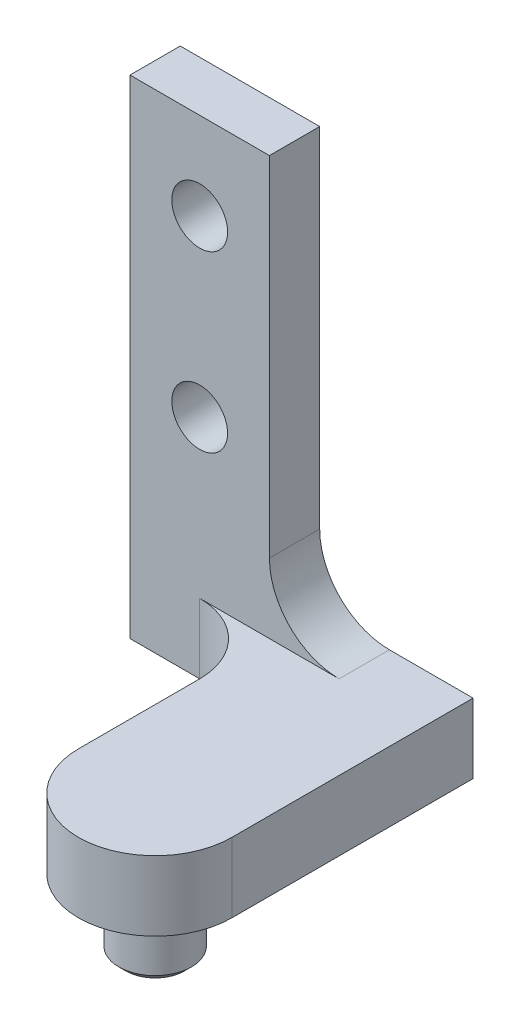
ISO-10303-21;
HEADER;
FILE_DESCRIPTION(('STEP AP214'),'2;1');
FILE_NAME('part.step','',(''),(''),'','','');
FILE_SCHEMA(('AUTOMOTIVE_DESIGN { 1 0 10303 214 1 1 1 1 }'));
ENDSEC;
DATA;
#1=APPLICATION_CONTEXT('core data for automotive mechanical design processes');
#2=APPLICATION_PROTOCOL_DEFINITION('international standard','automotive_design',2000,#1);
#3=PRODUCT_CONTEXT('',#1,'mechanical');
#4=PRODUCT('Part','Part','',(#3));
#5=PRODUCT_RELATED_PRODUCT_CATEGORY('part','',(#4));
#6=PRODUCT_DEFINITION_FORMATION('','',#4);
#7=PRODUCT_DEFINITION_CONTEXT('part definition',#1,'design');
#8=PRODUCT_DEFINITION('design','',#6,#7);
#9=PRODUCT_DEFINITION_SHAPE('','',#8);
#10=(LENGTH_UNIT() NAMED_UNIT(*) SI_UNIT(.MILLI.,.METRE.));
#11=(NAMED_UNIT(*) PLANE_ANGLE_UNIT() SI_UNIT($,.RADIAN.));
#12=(NAMED_UNIT(*) SI_UNIT($,.STERADIAN.) SOLID_ANGLE_UNIT());
#13=UNCERTAINTY_MEASURE_WITH_UNIT(LENGTH_MEASURE(1.E-05),#10,'distance_accuracy_value','');
#14=(GEOMETRIC_REPRESENTATION_CONTEXT(3) GLOBAL_UNCERTAINTY_ASSIGNED_CONTEXT((#13)) GLOBAL_UNIT_ASSIGNED_CONTEXT((#10,
#11,#12)) REPRESENTATION_CONTEXT('',''));
#15=CARTESIAN_POINT('',(0.,0.,0.));
#16=DIRECTION('',(0.,0.,1.));
#17=DIRECTION('',(1.,0.,0.));
#18=AXIS2_PLACEMENT_3D('',#15,#16,#17);
#19=CARTESIAN_POINT('',(-16.0962648941527,5.,4.61112093037529));
#20=DIRECTION('',(0.,-1.,0.));
#21=DIRECTION('',(0.,0.,-1.));
#22=AXIS2_PLACEMENT_3D('',#19,#20,#21);
#23=CYLINDRICAL_SURFACE('',#22,5.5);
#24=CARTESIAN_POINT('',(-16.0962648941527,0.,4.61112093037529));
#25=DIRECTION('',(0.,1.,0.));
#26=DIRECTION('',(0.,0.,1.));
#27=AXIS2_PLACEMENT_3D('',#24,#25,#26);
#28=CIRCLE('',#27,5.5);
#29=CARTESIAN_POINT('',(-21.5962648941527,0.,4.61112093037529));
#30=VERTEX_POINT('',#29);
#31=CARTESIAN_POINT('',(-10.5962648941527,0.,4.61112093037529));
#32=VERTEX_POINT('',#31);
#33=EDGE_CURVE('E159',#30,#32,#28,.T.);
#34=ORIENTED_EDGE('',*,*,#33,.T.);
#35=DIRECTION('',(0.,-1.,0.));
#36=VECTOR('',#35,1.);
#37=CARTESIAN_POINT('',(-10.5962648941527,5.,4.61112093037529));
#38=LINE('',#37,#36);
#39=CARTESIAN_POINT('',(-10.5962648941527,5.,4.61112093037529));
#40=VERTEX_POINT('',#39);
#41=EDGE_CURVE('E186',#40,#32,#38,.T.);
#42=ORIENTED_EDGE('',*,*,#41,.F.);
#43=CARTESIAN_POINT('',(-16.0962648941527,5.,4.61112093037529));
#44=DIRECTION('',(0.,1.,0.));
#45=DIRECTION('',(0.,0.,1.));
#46=AXIS2_PLACEMENT_3D('',#43,#44,#45);
#47=CIRCLE('',#46,5.5);
#48=CARTESIAN_POINT('',(-21.5962648941527,5.,4.61112093037529));
#49=VERTEX_POINT('',#48);
#50=EDGE_CURVE('E163',#49,#40,#47,.T.);
#51=ORIENTED_EDGE('',*,*,#50,.F.);
#52=DIRECTION('',(0.,-1.,0.));
#53=VECTOR('',#52,1.);
#54=CARTESIAN_POINT('',(-21.5962648941527,5.,4.61112093037529));
#55=LINE('',#54,#53);
#56=EDGE_CURVE('E175',#49,#30,#55,.T.);
#57=ORIENTED_EDGE('',*,*,#56,.T.);
#58=EDGE_LOOP('',(#34,#42,#51,#57));
#59=FACE_BOUND('',#58,.T.);
#60=ADVANCED_FACE('F45',(#59),#23,.T.);
#61=CARTESIAN_POINT('',(-10.5962648941527,5.,0.));
#62=DIRECTION('',(-1.,0.,0.));
#63=DIRECTION('',(0.,0.,1.));
#64=AXIS2_PLACEMENT_3D('',#61,#62,#63);
#65=PLANE('',#64);
#66=DIRECTION('',(0.,0.,-1.));
#67=VECTOR('',#66,1.);
#68=CARTESIAN_POINT('',(-10.5962648941527,0.,0.));
#69=LINE('',#68,#67);
#70=CARTESIAN_POINT('',(-10.5962648941527,0.,-12.6888790696247));
#71=VERTEX_POINT('',#70);
#72=EDGE_CURVE('E178',#32,#71,#69,.T.);
#73=ORIENTED_EDGE('',*,*,#72,.T.);
#74=DIRECTION('',(0.,-1.,0.));
#75=VECTOR('',#74,1.);
#76=CARTESIAN_POINT('',(-10.5962648941527,5.,-12.6888790696247));
#77=LINE('',#76,#75);
#78=CARTESIAN_POINT('',(-10.5962648941527,5.,-12.6888790696247));
#79=VERTEX_POINT('',#78);
#80=EDGE_CURVE('E184',#79,#71,#77,.T.);
#81=ORIENTED_EDGE('',*,*,#80,.F.);
#82=DIRECTION('',(0.,0.,-1.));
#83=VECTOR('',#82,1.);
#84=CARTESIAN_POINT('',(-10.5962648941527,5.,0.));
#85=LINE('',#84,#83);
#86=EDGE_CURVE('E166',#40,#79,#85,.T.);
#87=ORIENTED_EDGE('',*,*,#86,.F.);
#88=ORIENTED_EDGE('',*,*,#41,.T.);
#89=EDGE_LOOP('',(#73,#81,#87,#88));
#90=FACE_BOUND('',#89,.T.);
#91=ADVANCED_FACE('F242',(#90),#65,.F.);
#92=CARTESIAN_POINT('',(0.,5.,-12.6888790696247));
#93=DIRECTION('',(0.,0.,1.));
#94=DIRECTION('',(1.,0.,0.));
#95=AXIS2_PLACEMENT_3D('',#92,#93,#94);
#96=PLANE('',#95);
#97=CARTESIAN_POINT('',(-26.5962648941527,28.75,-12.6888790696247));
#98=DIRECTION('',(0.,0.,1.));
#99=DIRECTION('',(1.,0.,0.));
#100=AXIS2_PLACEMENT_3D('',#97,#98,#99);
#101=CIRCLE('',#100,2.);
#102=CARTESIAN_POINT('',(-24.5962648941527,28.75,-12.6888790696247));
#103=VERTEX_POINT('',#102);
#104=EDGE_CURVE('E152',#103,#103,#101,.T.);
#105=ORIENTED_EDGE('',*,*,#104,.T.);
#106=EDGE_LOOP('',(#105));
#107=FACE_BOUND('',#106,.T.);
#108=CARTESIAN_POINT('',(-26.5962648941527,16.25,-12.6888790696247));
#109=DIRECTION('',(0.,0.,1.));
#110=DIRECTION('',(1.,0.,0.));
#111=AXIS2_PLACEMENT_3D('',#108,#109,#110);
#112=CIRCLE('',#111,2.);
#113=CARTESIAN_POINT('',(-24.5962648941527,16.25,-12.6888790696247));
#114=VERTEX_POINT('',#113);
#115=EDGE_CURVE('E416',#114,#114,#112,.T.);
#116=ORIENTED_EDGE('',*,*,#115,.T.);
#117=EDGE_LOOP('',(#116));
#118=FACE_BOUND('',#117,.T.);
#119=DIRECTION('',(-1.,0.,0.));
#120=VECTOR('',#119,1.);
#121=CARTESIAN_POINT('',(0.,0.,-12.6888790696247));
#122=LINE('',#121,#120);
#123=CARTESIAN_POINT('',(-31.5962648941527,0.,-12.6888790696247));
#124=VERTEX_POINT('',#123);
#125=EDGE_CURVE('E136',#71,#124,#122,.T.);
#126=ORIENTED_EDGE('',*,*,#125,.T.);
#127=DIRECTION('',(0.,-1.,0.));
#128=VECTOR('',#127,1.);
#129=CARTESIAN_POINT('',(-31.5962648941527,35.,-12.6888790696247));
#130=LINE('',#129,#128);
#131=CARTESIAN_POINT('',(-31.5962648941527,35.,-12.6888790696247));
#132=VERTEX_POINT('',#131);
#133=EDGE_CURVE('E132',#132,#124,#130,.T.);
#134=ORIENTED_EDGE('',*,*,#133,.F.);
#135=DIRECTION('',(-1.,0.,0.));
#136=VECTOR('',#135,1.);
#137=CARTESIAN_POINT('',(0.,35.,-12.6888790696247));
#138=LINE('',#137,#136);
#139=CARTESIAN_POINT('',(-21.5962648941527,35.,-12.6888790696247));
#140=VERTEX_POINT('',#139);
#141=EDGE_CURVE('E120',#140,#132,#138,.T.);
#142=ORIENTED_EDGE('',*,*,#141,.F.);
#143=DIRECTION('',(0.,-1.,0.));
#144=VECTOR('',#143,1.);
#145=CARTESIAN_POINT('',(-21.5962648941527,35.,-12.6888790696247));
#146=LINE('',#145,#144);
#147=CARTESIAN_POINT('',(-21.5962648941527,10.,-12.6888790696247));
#148=VERTEX_POINT('',#147);
#149=EDGE_CURVE('E140',#140,#148,#146,.T.);
#150=ORIENTED_EDGE('',*,*,#149,.T.);
#151=CARTESIAN_POINT('',(-16.5962648941527,10.,-12.6888790696247));
#152=DIRECTION('',(0.,0.,1.));
#153=DIRECTION('',(1.,0.,0.));
#154=AXIS2_PLACEMENT_3D('',#151,#152,#153);
#155=CIRCLE('',#154,5.);
#156=CARTESIAN_POINT('',(-16.5962648941527,5.,-12.6888790696247));
#157=VERTEX_POINT('',#156);
#158=EDGE_CURVE('E11',#148,#157,#155,.T.);
#159=ORIENTED_EDGE('',*,*,#158,.T.);
#160=DIRECTION('',(-1.,0.,0.));
#161=VECTOR('',#160,1.);
#162=CARTESIAN_POINT('',(0.,5.,-12.6888790696247));
#163=LINE('',#162,#161);
#164=EDGE_CURVE('E169',#79,#157,#163,.T.);
#165=ORIENTED_EDGE('',*,*,#164,.F.);
#166=ORIENTED_EDGE('',*,*,#80,.T.);
#167=EDGE_LOOP('',(#126,#134,#142,#150,#159,#165,#166));
#168=FACE_BOUND('',#167,.T.);
#169=ADVANCED_FACE('F133',(#107,#118,#168),#96,.F.);
#170=CARTESIAN_POINT('',(-21.5962648941527,5.,0.));
#171=DIRECTION('',(-1.,0.,0.));
#172=DIRECTION('',(0.,0.,1.));
#173=AXIS2_PLACEMENT_3D('',#170,#171,#172);
#174=PLANE('',#173);
#175=DIRECTION('',(0.,0.,-1.));
#176=VECTOR('',#175,1.);
#177=CARTESIAN_POINT('',(-21.5962648941527,5.,0.));
#178=LINE('',#177,#176);
#179=CARTESIAN_POINT('',(-21.5962648941527,5.,-4.08211482402037));
#180=VERTEX_POINT('',#179);
#181=EDGE_CURVE('E172',#49,#180,#178,.T.);
#182=ORIENTED_EDGE('',*,*,#181,.T.);
#183=DIRECTION('',(0.,-1.,0.));
#184=VECTOR('',#183,1.);
#185=CARTESIAN_POINT('',(-21.5962648941527,0.,-4.08211482402037));
#186=LINE('',#185,#184);
#187=CARTESIAN_POINT('',(-21.5962648941527,0.,-4.08211482402037));
#188=VERTEX_POINT('',#187);
#189=EDGE_CURVE('E201',#180,#188,#186,.T.);
#190=ORIENTED_EDGE('',*,*,#189,.T.);
#191=DIRECTION('',(0.,0.,-1.));
#192=VECTOR('',#191,1.);
#193=CARTESIAN_POINT('',(-21.5962648941527,0.,0.));
#194=LINE('',#193,#192);
#195=EDGE_CURVE('E167',#30,#188,#194,.T.);
#196=ORIENTED_EDGE('',*,*,#195,.F.);
#197=ORIENTED_EDGE('',*,*,#56,.F.);
#198=EDGE_LOOP('',(#182,#190,#196,#197));
#199=FACE_BOUND('',#198,.T.);
#200=ADVANCED_FACE('F235',(#199),#174,.T.);
#201=CARTESIAN_POINT('',(0.,5.,0.));
#202=DIRECTION('',(0.,1.,0.));
#203=DIRECTION('',(0.,0.,1.));
#204=AXIS2_PLACEMENT_3D('',#201,#202,#203);
#205=PLANE('',#204);
#206=ORIENTED_EDGE('',*,*,#164,.T.);
#207=DIRECTION('',(0.,0.,1.));
#208=VECTOR('',#207,1.);
#209=CARTESIAN_POINT('',(-16.5962648941527,5.,0.));
#210=LINE('',#209,#208);
#211=CARTESIAN_POINT('',(-16.5962648941527,5.,-9.08211482402037));
#212=VERTEX_POINT('',#211);
#213=EDGE_CURVE('E213',#157,#212,#210,.T.);
#214=ORIENTED_EDGE('',*,*,#213,.T.);
#215=DIRECTION('',(1.,0.,0.));
#216=VECTOR('',#215,1.);
#217=CARTESIAN_POINT('',(0.,5.,-9.08211482402037));
#218=LINE('',#217,#216);
#219=CARTESIAN_POINT('',(-26.5962648941527,5.,-9.08211482402037));
#220=VERTEX_POINT('',#219);
#221=EDGE_CURVE('E204',#220,#212,#218,.T.);
#222=ORIENTED_EDGE('',*,*,#221,.F.);
#223=CARTESIAN_POINT('',(-26.5962648941527,5.,-4.08211482402037));
#224=DIRECTION('',(0.,1.,0.));
#225=DIRECTION('',(0.,0.,1.));
#226=AXIS2_PLACEMENT_3D('',#223,#224,#225);
#227=CIRCLE('',#226,5.);
#228=EDGE_CURVE('E211',#220,#180,#227,.F.);
#229=ORIENTED_EDGE('',*,*,#228,.T.);
#230=ORIENTED_EDGE('',*,*,#181,.F.);
#231=ORIENTED_EDGE('',*,*,#50,.T.);
#232=ORIENTED_EDGE('',*,*,#86,.T.);
#233=EDGE_LOOP('',(#206,#214,#222,#229,#230,#231,#232));
#234=FACE_BOUND('',#233,.T.);
#235=ADVANCED_FACE('F218',(#234),#205,.T.);
#236=CARTESIAN_POINT('',(0.,0.,0.));
#237=DIRECTION('',(0.,1.,0.));
#238=DIRECTION('',(0.,0.,1.));
#239=AXIS2_PLACEMENT_3D('',#236,#237,#238);
#240=PLANE('',#239);
#241=CARTESIAN_POINT('',(-16.0962648941527,0.,4.61112093037529));
#242=DIRECTION('',(0.,1.,0.));
#243=DIRECTION('',(0.,0.,1.));
#244=AXIS2_PLACEMENT_3D('',#241,#242,#243);
#245=CIRCLE('',#244,3.6);
#246=CARTESIAN_POINT('',(-16.0962648941527,0.,8.21112093037528));
#247=VERTEX_POINT('',#246);
#248=EDGE_CURVE('E195',#247,#247,#245,.T.);
#249=ORIENTED_EDGE('',*,*,#248,.T.);
#250=EDGE_LOOP('',(#249));
#251=FACE_BOUND('',#250,.T.);
#252=ORIENTED_EDGE('',*,*,#33,.F.);
#253=ORIENTED_EDGE('',*,*,#195,.T.);
#254=CARTESIAN_POINT('',(-26.5962648941527,0.,-4.08211482402037));
#255=DIRECTION('',(0.,1.,0.));
#256=DIRECTION('',(0.,0.,1.));
#257=AXIS2_PLACEMENT_3D('',#254,#255,#256);
#258=CIRCLE('',#257,5.);
#259=CARTESIAN_POINT('',(-26.5962648941527,0.,-9.08211482402037));
#260=VERTEX_POINT('',#259);
#261=EDGE_CURVE('E209',#188,#260,#258,.T.);
#262=ORIENTED_EDGE('',*,*,#261,.T.);
#263=DIRECTION('',(-1.,0.,0.));
#264=VECTOR('',#263,1.);
#265=CARTESIAN_POINT('',(0.,0.,-9.08211482402037));
#266=LINE('',#265,#264);
#267=CARTESIAN_POINT('',(-31.5962648941527,0.,-9.08211482402037));
#268=VERTEX_POINT('',#267);
#269=EDGE_CURVE('E147',#260,#268,#266,.T.);
#270=ORIENTED_EDGE('',*,*,#269,.T.);
#271=DIRECTION('',(0.,0.,1.));
#272=VECTOR('',#271,1.);
#273=CARTESIAN_POINT('',(-31.5962648941527,0.,0.));
#274=LINE('',#273,#272);
#275=EDGE_CURVE('E149',#124,#268,#274,.T.);
#276=ORIENTED_EDGE('',*,*,#275,.F.);
#277=ORIENTED_EDGE('',*,*,#125,.F.);
#278=ORIENTED_EDGE('',*,*,#72,.F.);
#279=EDGE_LOOP('',(#252,#253,#262,#270,#276,#277,#278));
#280=FACE_BOUND('',#279,.T.);
#281=ADVANCED_FACE('F228',(#251,#280),#240,.F.);
#282=CARTESIAN_POINT('',(-16.0962648941527,-5.,4.61112093037529));
#283=DIRECTION('',(0.,1.,0.));
#284=DIRECTION('',(0.,0.,1.));
#285=AXIS2_PLACEMENT_3D('',#282,#283,#284);
#286=CYLINDRICAL_SURFACE('',#285,2.6);
#287=CARTESIAN_POINT('',(-16.0962648941527,-1.,4.61112093037529));
#288=DIRECTION('',(0.,1.,0.));
#289=DIRECTION('',(0.,0.,1.));
#290=AXIS2_PLACEMENT_3D('',#287,#288,#289);
#291=CIRCLE('',#290,2.6);
#292=CARTESIAN_POINT('',(-16.0962648941527,-1.,7.21112093037528));
#293=VERTEX_POINT('',#292);
#294=EDGE_CURVE('E198',#293,#293,#291,.F.);
#295=ORIENTED_EDGE('',*,*,#294,.T.);
#296=EDGE_LOOP('',(#295));
#297=FACE_BOUND('',#296,.T.);
#298=CARTESIAN_POINT('',(-16.0962648941527,-4.5,4.61112093037529));
#299=DIRECTION('',(0.,1.,0.));
#300=DIRECTION('',(0.,0.,1.));
#301=AXIS2_PLACEMENT_3D('',#298,#299,#300);
#302=CIRCLE('',#301,2.6);
#303=CARTESIAN_POINT('',(-16.0962648941527,-4.5,7.21112093037528));
#304=VERTEX_POINT('',#303);
#305=EDGE_CURVE('E189',#304,#304,#302,.T.);
#306=ORIENTED_EDGE('',*,*,#305,.T.);
#307=EDGE_LOOP('',(#306));
#308=FACE_BOUND('',#307,.T.);
#309=ADVANCED_FACE('F286',(#297,#308),#286,.T.);
#310=CARTESIAN_POINT('',(0.,-5.,0.));
#311=DIRECTION('',(0.,1.,0.));
#312=DIRECTION('',(0.,0.,1.));
#313=AXIS2_PLACEMENT_3D('',#310,#311,#312);
#314=PLANE('',#313);
#315=CARTESIAN_POINT('',(-16.0962648941527,-5.,4.61112093037529));
#316=DIRECTION('',(0.,1.,0.));
#317=DIRECTION('',(0.,0.,1.));
#318=AXIS2_PLACEMENT_3D('',#315,#316,#317);
#319=CIRCLE('',#318,2.1);
#320=CARTESIAN_POINT('',(-16.0962648941527,-5.,6.71112093037528));
#321=VERTEX_POINT('',#320);
#322=EDGE_CURVE('E192',#321,#321,#319,.F.);
#323=ORIENTED_EDGE('',*,*,#322,.T.);
#324=EDGE_LOOP('',(#323));
#325=FACE_BOUND('',#324,.T.);
#326=ADVANCED_FACE('F261',(#325),#314,.F.);
#327=CARTESIAN_POINT('',(-16.0962648941527,-4.5,4.61112093037529));
#328=DIRECTION('',(0.,1.,0.));
#329=DIRECTION('',(0.,0.,1.));
#330=AXIS2_PLACEMENT_3D('',#327,#328,#329);
#331=CONICAL_SURFACE('',#330,2.6,0.78539816339745);
#332=ORIENTED_EDGE('',*,*,#322,.F.);
#333=EDGE_LOOP('',(#332));
#334=FACE_BOUND('',#333,.T.);
#335=ORIENTED_EDGE('',*,*,#305,.F.);
#336=EDGE_LOOP('',(#335));
#337=FACE_BOUND('',#336,.T.);
#338=ADVANCED_FACE('F255',(#334,#337),#331,.T.);
#339=CARTESIAN_POINT('',(-16.0962648941527,-1.,4.61112093037529));
#340=DIRECTION('',(0.,1.,0.));
#341=DIRECTION('',(0.,0.,1.));
#342=AXIS2_PLACEMENT_3D('',#339,#340,#341);
#343=TOROIDAL_SURFACE('',#342,3.6,1.);
#344=ORIENTED_EDGE('',*,*,#294,.F.);
#345=EDGE_LOOP('',(#344));
#346=FACE_BOUND('',#345,.T.);
#347=ORIENTED_EDGE('',*,*,#248,.F.);
#348=EDGE_LOOP('',(#347));
#349=FACE_BOUND('',#348,.T.);
#350=ADVANCED_FACE('F260',(#346,#349),#343,.F.);
#351=CARTESIAN_POINT('',(-31.5962648941527,35.,0.));
#352=DIRECTION('',(1.,0.,0.));
#353=DIRECTION('',(0.,0.,-1.));
#354=AXIS2_PLACEMENT_3D('',#351,#352,#353);
#355=PLANE('',#354);
#356=ORIENTED_EDGE('',*,*,#275,.T.);
#357=DIRECTION('',(0.,-1.,0.));
#358=VECTOR('',#357,1.);
#359=CARTESIAN_POINT('',(-31.5962648941527,35.,-9.08211482402037));
#360=LINE('',#359,#358);
#361=CARTESIAN_POINT('',(-31.5962648941527,35.,-9.08211482402037));
#362=VERTEX_POINT('',#361);
#363=EDGE_CURVE('E145',#362,#268,#360,.T.);
#364=ORIENTED_EDGE('',*,*,#363,.F.);
#365=DIRECTION('',(0.,0.,1.));
#366=VECTOR('',#365,1.);
#367=CARTESIAN_POINT('',(-31.5962648941527,35.,0.));
#368=LINE('',#367,#366);
#369=EDGE_CURVE('E125',#132,#362,#368,.T.);
#370=ORIENTED_EDGE('',*,*,#369,.F.);
#371=ORIENTED_EDGE('',*,*,#133,.T.);
#372=EDGE_LOOP('',(#356,#364,#370,#371));
#373=FACE_BOUND('',#372,.T.);
#374=ADVANCED_FACE('F143',(#373),#355,.F.);
#375=CARTESIAN_POINT('',(0.,35.,-9.08211482402037));
#376=DIRECTION('',(0.,0.,1.));
#377=DIRECTION('',(1.,0.,0.));
#378=AXIS2_PLACEMENT_3D('',#375,#376,#377);
#379=PLANE('',#378);
#380=CARTESIAN_POINT('',(-26.5962648941527,28.75,-9.08211482402037));
#381=DIRECTION('',(0.,0.,1.));
#382=DIRECTION('',(1.,0.,0.));
#383=AXIS2_PLACEMENT_3D('',#380,#381,#382);
#384=CIRCLE('',#383,2.);
#385=CARTESIAN_POINT('',(-24.5962648941527,28.75,-9.08211482402037));
#386=VERTEX_POINT('',#385);
#387=EDGE_CURVE('E413',#386,#386,#384,.T.);
#388=ORIENTED_EDGE('',*,*,#387,.F.);
#389=EDGE_LOOP('',(#388));
#390=FACE_BOUND('',#389,.T.);
#391=CARTESIAN_POINT('',(-26.5962648941527,16.25,-9.08211482402037));
#392=DIRECTION('',(0.,0.,1.));
#393=DIRECTION('',(-1.,0.,0.));
#394=AXIS2_PLACEMENT_3D('',#391,#392,#393);
#395=CIRCLE('',#394,2.);
#396=CARTESIAN_POINT('',(-28.5962648941527,16.25,-9.08211482402037));
#397=VERTEX_POINT('',#396);
#398=EDGE_CURVE('E420',#397,#397,#395,.T.);
#399=ORIENTED_EDGE('',*,*,#398,.F.);
#400=EDGE_LOOP('',(#399));
#401=FACE_BOUND('',#400,.T.);
#402=ORIENTED_EDGE('',*,*,#269,.F.);
#403=DIRECTION('',(0.,-1.,0.));
#404=VECTOR('',#403,1.);
#405=CARTESIAN_POINT('',(-26.5962648941527,5.,-9.08211482402037));
#406=LINE('',#405,#404);
#407=EDGE_CURVE('E206',#260,#220,#406,.F.);
#408=ORIENTED_EDGE('',*,*,#407,.T.);
#409=ORIENTED_EDGE('',*,*,#221,.T.);
#410=CARTESIAN_POINT('',(-16.5962648941527,10.,-9.08211482402037));
#411=DIRECTION('',(0.,0.,1.));
#412=DIRECTION('',(1.,0.,0.));
#413=AXIS2_PLACEMENT_3D('',#410,#411,#412);
#414=CIRCLE('',#413,5.);
#415=CARTESIAN_POINT('',(-21.5962648941527,10.,-9.08211482402037));
#416=VERTEX_POINT('',#415);
#417=EDGE_CURVE('E53',#212,#416,#414,.F.);
#418=ORIENTED_EDGE('',*,*,#417,.T.);
#419=DIRECTION('',(0.,-1.,0.));
#420=VECTOR('',#419,1.);
#421=CARTESIAN_POINT('',(-21.5962648941527,35.,-9.08211482402037));
#422=LINE('',#421,#420);
#423=CARTESIAN_POINT('',(-21.5962648941527,35.,-9.08211482402037));
#424=VERTEX_POINT('',#423);
#425=EDGE_CURVE('E160',#424,#416,#422,.T.);
#426=ORIENTED_EDGE('',*,*,#425,.F.);
#427=DIRECTION('',(-1.,0.,0.));
#428=VECTOR('',#427,1.);
#429=CARTESIAN_POINT('',(0.,35.,-9.08211482402037));
#430=LINE('',#429,#428);
#431=EDGE_CURVE('E141',#424,#362,#430,.T.);
#432=ORIENTED_EDGE('',*,*,#431,.T.);
#433=ORIENTED_EDGE('',*,*,#363,.T.);
#434=EDGE_LOOP('',(#402,#408,#409,#418,#426,#432,#433));
#435=FACE_BOUND('',#434,.T.);
#436=ADVANCED_FACE('F224',(#390,#401,#435),#379,.T.);
#437=CARTESIAN_POINT('',(-21.5962648941527,35.,0.));
#438=DIRECTION('',(-1.,0.,0.));
#439=DIRECTION('',(0.,0.,1.));
#440=AXIS2_PLACEMENT_3D('',#437,#438,#439);
#441=PLANE('',#440);
#442=ORIENTED_EDGE('',*,*,#425,.T.);
#443=DIRECTION('',(0.,0.,1.));
#444=VECTOR('',#443,1.);
#445=CARTESIAN_POINT('',(-21.5962648941527,10.,0.));
#446=LINE('',#445,#444);
#447=EDGE_CURVE('E66',#416,#148,#446,.F.);
#448=ORIENTED_EDGE('',*,*,#447,.T.);
#449=ORIENTED_EDGE('',*,*,#149,.F.);
#450=DIRECTION('',(0.,0.,-1.));
#451=VECTOR('',#450,1.);
#452=CARTESIAN_POINT('',(-21.5962648941527,35.,0.));
#453=LINE('',#452,#451);
#454=EDGE_CURVE('E128',#424,#140,#453,.T.);
#455=ORIENTED_EDGE('',*,*,#454,.F.);
#456=EDGE_LOOP('',(#442,#448,#449,#455));
#457=FACE_BOUND('',#456,.T.);
#458=ADVANCED_FACE('F222',(#457),#441,.F.);
#459=CARTESIAN_POINT('',(0.,35.,0.));
#460=DIRECTION('',(0.,-1.,0.));
#461=DIRECTION('',(0.,0.,-1.));
#462=AXIS2_PLACEMENT_3D('',#459,#460,#461);
#463=PLANE('',#462);
#464=ORIENTED_EDGE('',*,*,#369,.T.);
#465=ORIENTED_EDGE('',*,*,#431,.F.);
#466=ORIENTED_EDGE('',*,*,#454,.T.);
#467=ORIENTED_EDGE('',*,*,#141,.T.);
#468=EDGE_LOOP('',(#464,#465,#466,#467));
#469=FACE_BOUND('',#468,.T.);
#470=ADVANCED_FACE('F122',(#469),#463,.F.);
#471=CARTESIAN_POINT('',(-26.5962648941527,5.,-4.08211482402037));
#472=DIRECTION('',(0.,1.,0.));
#473=DIRECTION('',(0.,0.,1.));
#474=AXIS2_PLACEMENT_3D('',#471,#472,#473);
#475=CYLINDRICAL_SURFACE('',#474,5.);
#476=ORIENTED_EDGE('',*,*,#228,.F.);
#477=ORIENTED_EDGE('',*,*,#407,.F.);
#478=ORIENTED_EDGE('',*,*,#261,.F.);
#479=ORIENTED_EDGE('',*,*,#189,.F.);
#480=EDGE_LOOP('',(#476,#477,#478,#479));
#481=FACE_BOUND('',#480,.T.);
#482=ADVANCED_FACE('F233',(#481),#475,.F.);
#483=CARTESIAN_POINT('',(-16.5962648941527,10.,0.));
#484=DIRECTION('',(0.,0.,1.));
#485=DIRECTION('',(1.,0.,0.));
#486=AXIS2_PLACEMENT_3D('',#483,#484,#485);
#487=CYLINDRICAL_SURFACE('',#486,5.);
#488=ORIENTED_EDGE('',*,*,#158,.F.);
#489=ORIENTED_EDGE('',*,*,#447,.F.);
#490=ORIENTED_EDGE('',*,*,#417,.F.);
#491=ORIENTED_EDGE('',*,*,#213,.F.);
#492=EDGE_LOOP('',(#488,#489,#490,#491));
#493=FACE_BOUND('',#492,.T.);
#494=ADVANCED_FACE('F47',(#493),#487,.F.);
#495=CARTESIAN_POINT('',(-26.5962648941527,16.25,-44.0821148240204));
#496=DIRECTION('',(0.,0.,1.));
#497=DIRECTION('',(1.,0.,0.));
#498=AXIS2_PLACEMENT_3D('',#495,#496,#497);
#499=CYLINDRICAL_SURFACE('',#498,2.);
#500=ORIENTED_EDGE('',*,*,#398,.T.);
#501=EDGE_LOOP('',(#500));
#502=FACE_BOUND('',#501,.T.);
#503=ORIENTED_EDGE('',*,*,#115,.F.);
#504=EDGE_LOOP('',(#503));
#505=FACE_BOUND('',#504,.T.);
#506=ADVANCED_FACE('F270',(#502,#505),#499,.F.);
#507=CARTESIAN_POINT('',(-26.5962648941527,28.75,-44.0821148240204));
#508=DIRECTION('',(0.,0.,1.));
#509=DIRECTION('',(1.,0.,0.));
#510=AXIS2_PLACEMENT_3D('',#507,#508,#509);
#511=CYLINDRICAL_SURFACE('',#510,2.);
#512=ORIENTED_EDGE('',*,*,#387,.T.);
#513=EDGE_LOOP('',(#512));
#514=FACE_BOUND('',#513,.T.);
#515=ORIENTED_EDGE('',*,*,#104,.F.);
#516=EDGE_LOOP('',(#515));
#517=FACE_BOUND('',#516,.T.);
#518=ADVANCED_FACE('F395',(#514,#517),#511,.F.);
#519=CLOSED_SHELL('',(#60,#91,#169,#200,#235,#281,#309,#326,#338,#350,#374,#436,#458,#470,#482,
#494,#506,#518));
#520=MANIFOLD_SOLID_BREP('B2',#519);
#521=ADVANCED_BREP_SHAPE_REPRESENTATION('',(#18,#520),#14);
#522=SHAPE_DEFINITION_REPRESENTATION(#9,#521);
ENDSEC;
END-ISO-10303-21;
